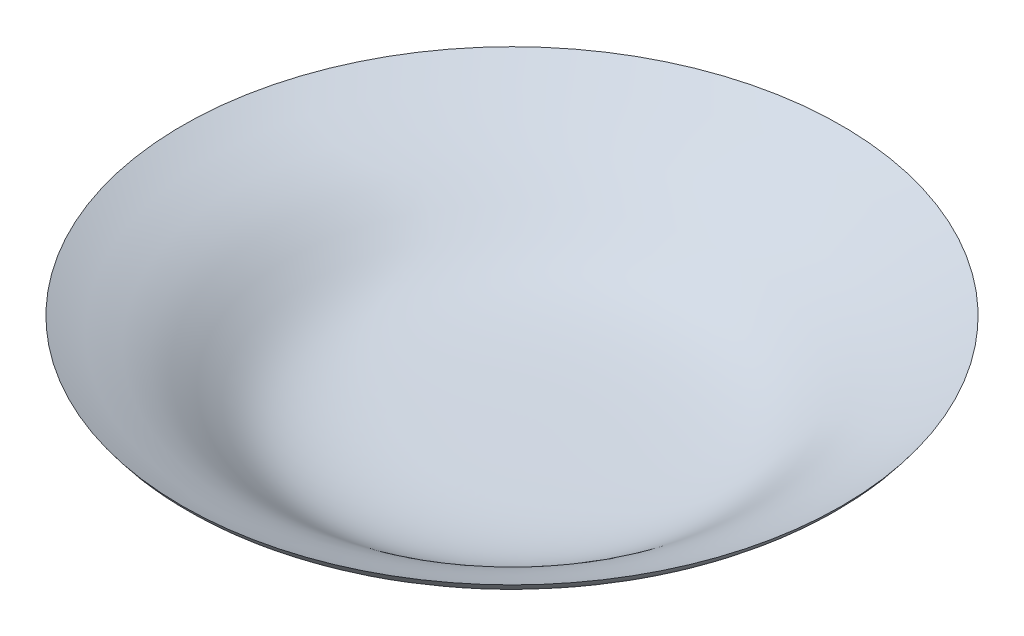
ISO-10303-21;
HEADER;
FILE_DESCRIPTION(('STEP AP214'),'2;1');
FILE_NAME('part.step','',(''),(''),'','','');
FILE_SCHEMA(('AUTOMOTIVE_DESIGN { 1 0 10303 214 1 1 1 1 }'));
ENDSEC;
DATA;
#1=APPLICATION_CONTEXT('core data for automotive mechanical design processes');
#2=APPLICATION_PROTOCOL_DEFINITION('international standard','automotive_design',2000,#1);
#3=PRODUCT_CONTEXT('',#1,'mechanical');
#4=PRODUCT('Part','Part','',(#3));
#5=PRODUCT_RELATED_PRODUCT_CATEGORY('part','',(#4));
#6=PRODUCT_DEFINITION_FORMATION('','',#4);
#7=PRODUCT_DEFINITION_CONTEXT('part definition',#1,'design');
#8=PRODUCT_DEFINITION('design','',#6,#7);
#9=PRODUCT_DEFINITION_SHAPE('','',#8);
#10=(LENGTH_UNIT() NAMED_UNIT(*) SI_UNIT(.MILLI.,.METRE.));
#11=(NAMED_UNIT(*) PLANE_ANGLE_UNIT() SI_UNIT($,.RADIAN.));
#12=(NAMED_UNIT(*) SI_UNIT($,.STERADIAN.) SOLID_ANGLE_UNIT());
#13=UNCERTAINTY_MEASURE_WITH_UNIT(LENGTH_MEASURE(1.E-05),#10,'distance_accuracy_value','');
#14=(GEOMETRIC_REPRESENTATION_CONTEXT(3) GLOBAL_UNCERTAINTY_ASSIGNED_CONTEXT((#13)) GLOBAL_UNIT_ASSIGNED_CONTEXT((#10,
#11,#12)) REPRESENTATION_CONTEXT('',''));
#15=CARTESIAN_POINT('',(0.,0.,0.));
#16=DIRECTION('',(0.,0.,1.));
#17=DIRECTION('',(1.,0.,0.));
#18=AXIS2_PLACEMENT_3D('',#15,#16,#17);
#19=CARTESIAN_POINT('',(0.,-21.3118179956347,0.));
#20=CARTESIAN_POINT('',(21.4157560424568,-18.0178699261797,0.));
#21=CARTESIAN_POINT('',(57.2698159264435,-27.8680952449008,0.));
#22=CARTESIAN_POINT('',(93.4569342549933,-5.02205072327134,0.));
#23=CARTESIAN_POINT('',(109.852293646379,14.0937947404186,0.));
#24=CARTESIAN_POINT('',(130.201815989649,19.5514720315392,0.));
#25=CARTESIAN_POINT('',(139.125746683125,25.6623383762701,0.));
#26=CARTESIAN_POINT('',(141.464391884537,29.375749129118,0.));
#27=B_SPLINE_CURVE_WITH_KNOTS('',3,(#19,#20,#21,#22,#23,#24,#25,#26),.UNSPECIFIED.,.F.,.F.,(4,1,
1,1,1,4),(0.,0.450987905016231,0.601513115194705,0.802525306539472,0.916032251947562,1.),.UNSPECIFIED.);
#28=CARTESIAN_POINT('',(0.,-16.7169600485835,0.));
#29=DIRECTION('',(0.,1.,0.));
#30=AXIS1_PLACEMENT('',#28,#29);
#31=SURFACE_OF_REVOLUTION('',#27,#30);
#32=CARTESIAN_POINT('',(0.,29.375749129118,0.));
#33=DIRECTION('',(0.,1.,0.));
#34=DIRECTION('',(0.,0.,1.));
#35=AXIS2_PLACEMENT_3D('',#32,#33,#34);
#36=CIRCLE('',#35,141.464391884537);
#37=CARTESIAN_POINT('',(0.,29.375749129118,141.464391884537));
#38=VERTEX_POINT('',#37);
#39=EDGE_CURVE('E11',#38,#38,#36,.T.);
#40=ORIENTED_EDGE('',*,*,#39,.F.);
#41=EDGE_LOOP('',(#40));
#42=FACE_BOUND('',#41,.T.);
#43=CARTESIAN_POINT('',(0.,-21.3118179956347,0.));
#44=VERTEX_POINT('',#43);
#45=VERTEX_LOOP('',#44);
#46=FACE_BOUND('',#45,.T.);
#47=ADVANCED_FACE('F43',(#42,#46),#31,.T.);
#48=CARTESIAN_POINT('',(141.464391884537,29.375749129118,0.));
#49=CARTESIAN_POINT('',(130.389784678776,23.4562042837752,0.));
#50=CARTESIAN_POINT('',(114.497581614074,16.8852236607648,0.));
#51=CARTESIAN_POINT('',(104.568838870399,11.5512993123446,0.));
#52=CARTESIAN_POINT('',(104.519969635021,11.3234790846519,0.));
#53=CARTESIAN_POINT('',(96.1861157974369,3.46331035053993,0.));
#54=CARTESIAN_POINT('',(88.8725839489624,-2.96073756838666,0.));
#55=CARTESIAN_POINT('',(84.4734103616887,-5.7598837249202,0.));
#56=CARTESIAN_POINT('',(80.2025774175021,-9.06754392975984,0.));
#57=CARTESIAN_POINT('',(77.1781455762621,-10.9919569123917,0.));
#58=CARTESIAN_POINT('',(67.3654083663848,-14.6782660739291,0.));
#59=CARTESIAN_POINT('',(57.6686766902981,-16.7169600485835,0.));
#60=CARTESIAN_POINT('',(36.050956325937,-16.7169600485835,0.));
#61=CARTESIAN_POINT('',(0.,-16.7169600485835,0.));
#62=B_SPLINE_CURVE_WITH_KNOTS('',13,(#48,#49,#50,#51,#52,#53,#54,#55,#56,#57,#58,#59,#60,#61),
.UNSPECIFIED.,.F.,.F.,(14,14),(0.,1.),.UNSPECIFIED.);
#63=CARTESIAN_POINT('',(0.,-16.7169600485835,0.));
#64=DIRECTION('',(0.,1.,0.));
#65=AXIS1_PLACEMENT('',#63,#64);
#66=SURFACE_OF_REVOLUTION('',#62,#65);
#67=CARTESIAN_POINT('',(0.,-16.7169600485835,0.));
#68=VERTEX_POINT('',#67);
#69=VERTEX_LOOP('',#68);
#70=FACE_BOUND('',#69,.T.);
#71=ORIENTED_EDGE('',*,*,#39,.T.);
#72=EDGE_LOOP('',(#71));
#73=FACE_BOUND('',#72,.T.);
#74=ADVANCED_FACE('F57',(#70,#73),#66,.T.);
#75=CLOSED_SHELL('',(#47,#74));
#76=MANIFOLD_SOLID_BREP('B2',#75);
#77=ADVANCED_BREP_SHAPE_REPRESENTATION('',(#18,#76),#14);
#78=SHAPE_DEFINITION_REPRESENTATION(#9,#77);
ENDSEC;
END-ISO-10303-21;
